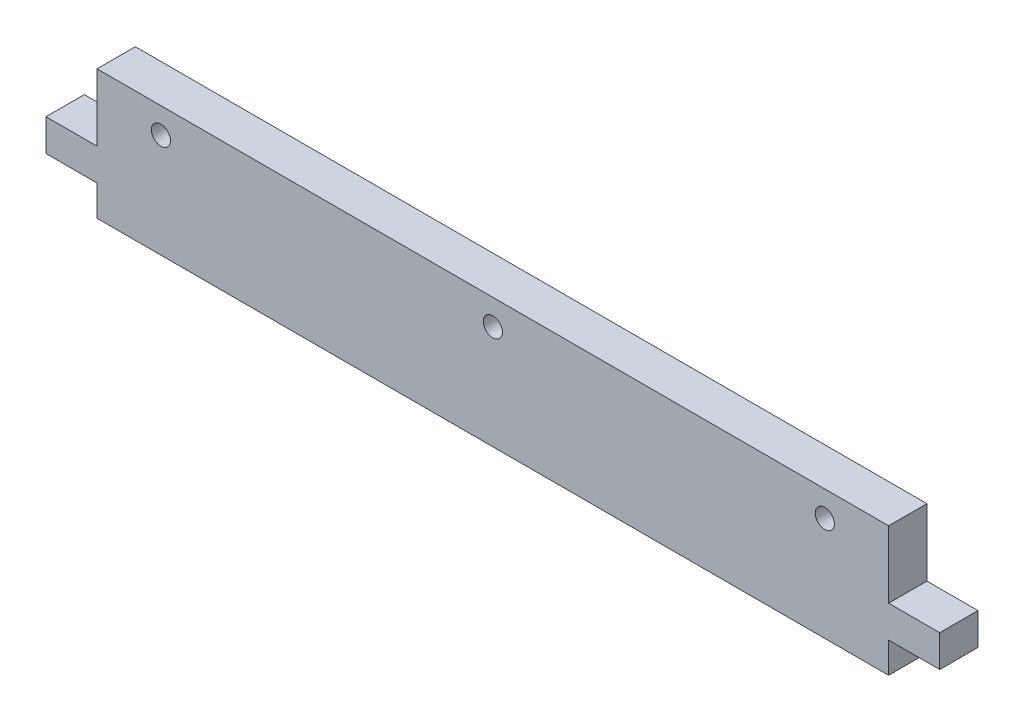
ISO-10303-21;
HEADER;
FILE_DESCRIPTION(('STEP AP214'),'2;1');
FILE_NAME('part.step','',(''),(''),'','','');
FILE_SCHEMA(('AUTOMOTIVE_DESIGN { 1 0 10303 214 1 1 1 1 }'));
ENDSEC;
DATA;
#1=APPLICATION_CONTEXT('core data for automotive mechanical design processes');
#2=APPLICATION_PROTOCOL_DEFINITION('international standard','automotive_design',2000,#1);
#3=PRODUCT_CONTEXT('',#1,'mechanical');
#4=PRODUCT('Part','Part','',(#3));
#5=PRODUCT_RELATED_PRODUCT_CATEGORY('part','',(#4));
#6=PRODUCT_DEFINITION_FORMATION('','',#4);
#7=PRODUCT_DEFINITION_CONTEXT('part definition',#1,'design');
#8=PRODUCT_DEFINITION('design','',#6,#7);
#9=PRODUCT_DEFINITION_SHAPE('','',#8);
#10=(LENGTH_UNIT() NAMED_UNIT(*) SI_UNIT(.MILLI.,.METRE.));
#11=(NAMED_UNIT(*) PLANE_ANGLE_UNIT() SI_UNIT($,.RADIAN.));
#12=(NAMED_UNIT(*) SI_UNIT($,.STERADIAN.) SOLID_ANGLE_UNIT());
#13=UNCERTAINTY_MEASURE_WITH_UNIT(LENGTH_MEASURE(1.E-05),#10,'distance_accuracy_value','');
#14=(GEOMETRIC_REPRESENTATION_CONTEXT(3) GLOBAL_UNCERTAINTY_ASSIGNED_CONTEXT((#13)) GLOBAL_UNIT_ASSIGNED_CONTEXT((#10,
#11,#12)) REPRESENTATION_CONTEXT('',''));
#15=CARTESIAN_POINT('',(0.,0.,0.));
#16=DIRECTION('',(0.,0.,1.));
#17=DIRECTION('',(1.,0.,0.));
#18=AXIS2_PLACEMENT_3D('',#15,#16,#17);
#19=CARTESIAN_POINT('',(124.,0.,6.));
#20=DIRECTION('',(-1.,0.,0.));
#21=DIRECTION('',(0.,0.,1.));
#22=AXIS2_PLACEMENT_3D('',#19,#20,#21);
#23=PLANE('',#22);
#24=DIRECTION('',(0.,0.,1.));
#25=VECTOR('',#24,1.);
#26=CARTESIAN_POINT('',(124.,9.78000000000002,0.));
#27=LINE('',#26,#25);
#28=CARTESIAN_POINT('',(124.,9.78000000000002,0.));
#29=VERTEX_POINT('',#28);
#30=CARTESIAN_POINT('',(124.,9.78000000000002,6.));
#31=VERTEX_POINT('',#30);
#32=EDGE_CURVE('E128',#29,#31,#27,.T.);
#33=ORIENTED_EDGE('',*,*,#32,.F.);
#34=DIRECTION('',(0.,1.,0.));
#35=VECTOR('',#34,1.);
#36=CARTESIAN_POINT('',(124.,0.,0.));
#37=LINE('',#36,#35);
#38=CARTESIAN_POINT('',(124.,20.28,0.));
#39=VERTEX_POINT('',#38);
#40=EDGE_CURVE('E141',#29,#39,#37,.T.);
#41=ORIENTED_EDGE('',*,*,#40,.T.);
#42=DIRECTION('',(0.,0.,-1.));
#43=VECTOR('',#42,1.);
#44=CARTESIAN_POINT('',(124.,20.28,6.));
#45=LINE('',#44,#43);
#46=CARTESIAN_POINT('',(124.,20.28,6.));
#47=VERTEX_POINT('',#46);
#48=EDGE_CURVE('E173',#47,#39,#45,.T.);
#49=ORIENTED_EDGE('',*,*,#48,.F.);
#50=DIRECTION('',(0.,1.,0.));
#51=VECTOR('',#50,1.);
#52=CARTESIAN_POINT('',(124.,0.,6.));
#53=LINE('',#52,#51);
#54=EDGE_CURVE('E143',#31,#47,#53,.T.);
#55=ORIENTED_EDGE('',*,*,#54,.F.);
#56=EDGE_LOOP('',(#33,#41,#49,#55));
#57=FACE_BOUND('',#56,.T.);
#58=ADVANCED_FACE('F34',(#57),#23,.F.);
#59=CARTESIAN_POINT('',(0.,0.,6.));
#60=DIRECTION('',(1.,0.,0.));
#61=DIRECTION('',(0.,0.,-1.));
#62=AXIS2_PLACEMENT_3D('',#59,#60,#61);
#63=PLANE('',#62);
#64=DIRECTION('',(0.,0.,1.));
#65=VECTOR('',#64,1.);
#66=CARTESIAN_POINT('',(0.,4.78,0.));
#67=LINE('',#66,#65);
#68=CARTESIAN_POINT('',(0.,4.78,0.));
#69=VERTEX_POINT('',#68);
#70=CARTESIAN_POINT('',(0.,4.78,6.));
#71=VERTEX_POINT('',#70);
#72=EDGE_CURVE('E275',#69,#71,#67,.T.);
#73=ORIENTED_EDGE('',*,*,#72,.F.);
#74=DIRECTION('',(0.,-1.,0.));
#75=VECTOR('',#74,1.);
#76=CARTESIAN_POINT('',(0.,0.,0.));
#77=LINE('',#76,#75);
#78=CARTESIAN_POINT('',(0.,0.,0.));
#79=VERTEX_POINT('',#78);
#80=EDGE_CURVE('E180',#69,#79,#77,.T.);
#81=ORIENTED_EDGE('',*,*,#80,.T.);
#82=DIRECTION('',(0.,0.,-1.));
#83=VECTOR('',#82,1.);
#84=CARTESIAN_POINT('',(0.,0.,6.));
#85=LINE('',#84,#83);
#86=CARTESIAN_POINT('',(0.,0.,6.));
#87=VERTEX_POINT('',#86);
#88=EDGE_CURVE('E11',#87,#79,#85,.T.);
#89=ORIENTED_EDGE('',*,*,#88,.F.);
#90=DIRECTION('',(0.,-1.,0.));
#91=VECTOR('',#90,1.);
#92=CARTESIAN_POINT('',(0.,0.,6.));
#93=LINE('',#92,#91);
#94=EDGE_CURVE('E169',#71,#87,#93,.T.);
#95=ORIENTED_EDGE('',*,*,#94,.F.);
#96=EDGE_LOOP('',(#73,#81,#89,#95));
#97=FACE_BOUND('',#96,.T.);
#98=ADVANCED_FACE('F248',(#97),#63,.F.);
#99=CARTESIAN_POINT('',(0.,20.28,0.));
#100=VERTEX_POINT('',#99);
#101=CARTESIAN_POINT('',(0.,9.78,0.));
#102=VERTEX_POINT('',#101);
#103=EDGE_CURVE('E156',#100,#102,#77,.T.);
#104=ORIENTED_EDGE('',*,*,#103,.T.);
#105=DIRECTION('',(0.,0.,1.));
#106=VECTOR('',#105,1.);
#107=CARTESIAN_POINT('',(0.,9.78,0.));
#108=LINE('',#107,#106);
#109=CARTESIAN_POINT('',(0.,9.78,6.));
#110=VERTEX_POINT('',#109);
#111=EDGE_CURVE('E293',#102,#110,#108,.T.);
#112=ORIENTED_EDGE('',*,*,#111,.T.);
#113=CARTESIAN_POINT('',(0.,20.28,6.));
#114=VERTEX_POINT('',#113);
#115=EDGE_CURVE('E316',#114,#110,#93,.T.);
#116=ORIENTED_EDGE('',*,*,#115,.F.);
#117=DIRECTION('',(0.,0.,-1.));
#118=VECTOR('',#117,1.);
#119=CARTESIAN_POINT('',(0.,20.28,6.));
#120=LINE('',#119,#118);
#121=EDGE_CURVE('E170',#114,#100,#120,.T.);
#122=ORIENTED_EDGE('',*,*,#121,.T.);
#123=EDGE_LOOP('',(#104,#112,#116,#122));
#124=FACE_BOUND('',#123,.T.);
#125=ADVANCED_FACE('F36',(#124),#63,.F.);
#126=CARTESIAN_POINT('',(0.,0.,6.));
#127=DIRECTION('',(0.,1.,0.));
#128=DIRECTION('',(0.,0.,1.));
#129=AXIS2_PLACEMENT_3D('',#126,#127,#128);
#130=PLANE('',#129);
#131=DIRECTION('',(1.,0.,0.));
#132=VECTOR('',#131,1.);
#133=CARTESIAN_POINT('',(0.,0.,0.));
#134=LINE('',#133,#132);
#135=CARTESIAN_POINT('',(124.,0.,0.));
#136=VERTEX_POINT('',#135);
#137=EDGE_CURVE('E152',#79,#136,#134,.T.);
#138=ORIENTED_EDGE('',*,*,#137,.T.);
#139=DIRECTION('',(0.,0.,-1.));
#140=VECTOR('',#139,1.);
#141=CARTESIAN_POINT('',(124.,0.,6.));
#142=LINE('',#141,#140);
#143=CARTESIAN_POINT('',(124.,0.,6.));
#144=VERTEX_POINT('',#143);
#145=EDGE_CURVE('E43',#144,#136,#142,.T.);
#146=ORIENTED_EDGE('',*,*,#145,.F.);
#147=DIRECTION('',(1.,0.,0.));
#148=VECTOR('',#147,1.);
#149=CARTESIAN_POINT('',(0.,0.,6.));
#150=LINE('',#149,#148);
#151=EDGE_CURVE('E187',#87,#144,#150,.T.);
#152=ORIENTED_EDGE('',*,*,#151,.F.);
#153=ORIENTED_EDGE('',*,*,#88,.T.);
#154=EDGE_LOOP('',(#138,#146,#152,#153));
#155=FACE_BOUND('',#154,.T.);
#156=ADVANCED_FACE('F258',(#155),#130,.F.);
#157=CARTESIAN_POINT('',(124.,4.78000000000002,0.));
#158=VERTEX_POINT('',#157);
#159=EDGE_CURVE('E151',#136,#158,#37,.T.);
#160=ORIENTED_EDGE('',*,*,#159,.T.);
#161=DIRECTION('',(0.,0.,1.));
#162=VECTOR('',#161,1.);
#163=CARTESIAN_POINT('',(124.,4.78000000000002,0.));
#164=LINE('',#163,#162);
#165=CARTESIAN_POINT('',(124.,4.78000000000002,6.));
#166=VERTEX_POINT('',#165);
#167=EDGE_CURVE('E144',#158,#166,#164,.T.);
#168=ORIENTED_EDGE('',*,*,#167,.T.);
#169=EDGE_CURVE('E161',#144,#166,#53,.T.);
#170=ORIENTED_EDGE('',*,*,#169,.F.);
#171=ORIENTED_EDGE('',*,*,#145,.T.);
#172=EDGE_LOOP('',(#160,#168,#170,#171));
#173=FACE_BOUND('',#172,.T.);
#174=ADVANCED_FACE('F250',(#173),#23,.F.);
#175=CARTESIAN_POINT('',(0.,20.28,6.));
#176=DIRECTION('',(0.,-1.,0.));
#177=DIRECTION('',(0.,0.,-1.));
#178=AXIS2_PLACEMENT_3D('',#175,#176,#177);
#179=PLANE('',#178);
#180=DIRECTION('',(-1.,0.,0.));
#181=VECTOR('',#180,1.);
#182=CARTESIAN_POINT('',(0.,20.28,0.));
#183=LINE('',#182,#181);
#184=EDGE_CURVE('E150',#39,#100,#183,.T.);
#185=ORIENTED_EDGE('',*,*,#184,.T.);
#186=ORIENTED_EDGE('',*,*,#121,.F.);
#187=DIRECTION('',(-1.,0.,0.));
#188=VECTOR('',#187,1.);
#189=CARTESIAN_POINT('',(0.,20.28,6.));
#190=LINE('',#189,#188);
#191=EDGE_CURVE('E174',#47,#114,#190,.T.);
#192=ORIENTED_EDGE('',*,*,#191,.F.);
#193=ORIENTED_EDGE('',*,*,#48,.T.);
#194=EDGE_LOOP('',(#185,#186,#192,#193));
#195=FACE_BOUND('',#194,.T.);
#196=ADVANCED_FACE('F257',(#195),#179,.F.);
#197=CARTESIAN_POINT('',(0.,0.,6.));
#198=DIRECTION('',(0.,0.,-1.));
#199=DIRECTION('',(-1.,0.,0.));
#200=AXIS2_PLACEMENT_3D('',#197,#198,#199);
#201=PLANE('',#200);
#202=CARTESIAN_POINT('',(10.,16.28,6.));
#203=DIRECTION('',(0.,0.,-1.));
#204=DIRECTION('',(-1.,0.,0.));
#205=AXIS2_PLACEMENT_3D('',#202,#203,#204);
#206=CIRCLE('',#205,1.5);
#207=CARTESIAN_POINT('',(8.50000000000001,16.28,6.));
#208=VERTEX_POINT('',#207);
#209=EDGE_CURVE('E362',#208,#208,#206,.T.);
#210=ORIENTED_EDGE('',*,*,#209,.T.);
#211=EDGE_LOOP('',(#210));
#212=FACE_BOUND('',#211,.T.);
#213=CARTESIAN_POINT('',(114.,16.28,6.));
#214=DIRECTION('',(0.,0.,-1.));
#215=DIRECTION('',(-1.,0.,0.));
#216=AXIS2_PLACEMENT_3D('',#213,#214,#215);
#217=CIRCLE('',#216,1.5);
#218=CARTESIAN_POINT('',(112.5,16.28,6.));
#219=VERTEX_POINT('',#218);
#220=EDGE_CURVE('E219',#219,#219,#217,.T.);
#221=ORIENTED_EDGE('',*,*,#220,.T.);
#222=EDGE_LOOP('',(#221));
#223=FACE_BOUND('',#222,.T.);
#224=CARTESIAN_POINT('',(62.,16.28,6.));
#225=DIRECTION('',(0.,0.,-1.));
#226=DIRECTION('',(-1.,0.,0.));
#227=AXIS2_PLACEMENT_3D('',#224,#225,#226);
#228=CIRCLE('',#227,1.5);
#229=CARTESIAN_POINT('',(60.5,16.28,6.));
#230=VERTEX_POINT('',#229);
#231=EDGE_CURVE('E210',#230,#230,#228,.T.);
#232=ORIENTED_EDGE('',*,*,#231,.T.);
#233=EDGE_LOOP('',(#232));
#234=FACE_BOUND('',#233,.T.);
#235=ORIENTED_EDGE('',*,*,#115,.T.);
#236=DIRECTION('',(-1.,0.,0.));
#237=VECTOR('',#236,1.);
#238=CARTESIAN_POINT('',(0.,9.78,6.));
#239=LINE('',#238,#237);
#240=CARTESIAN_POINT('',(-8.,9.78,6.));
#241=VERTEX_POINT('',#240);
#242=EDGE_CURVE('E59',#110,#241,#239,.T.);
#243=ORIENTED_EDGE('',*,*,#242,.T.);
#244=DIRECTION('',(0.,-1.,0.));
#245=VECTOR('',#244,1.);
#246=CARTESIAN_POINT('',(-8.,9.78,6.));
#247=LINE('',#246,#245);
#248=CARTESIAN_POINT('',(-8.,4.78,6.));
#249=VERTEX_POINT('',#248);
#250=EDGE_CURVE('E226',#241,#249,#247,.T.);
#251=ORIENTED_EDGE('',*,*,#250,.T.);
#252=DIRECTION('',(1.,0.,0.));
#253=VECTOR('',#252,1.);
#254=CARTESIAN_POINT('',(0.,4.78,6.));
#255=LINE('',#254,#253);
#256=EDGE_CURVE('E301',#249,#71,#255,.T.);
#257=ORIENTED_EDGE('',*,*,#256,.T.);
#258=ORIENTED_EDGE('',*,*,#94,.T.);
#259=ORIENTED_EDGE('',*,*,#151,.T.);
#260=ORIENTED_EDGE('',*,*,#169,.T.);
#261=DIRECTION('',(1.,0.,0.));
#262=VECTOR('',#261,1.);
#263=CARTESIAN_POINT('',(124.,4.78000000000002,6.));
#264=LINE('',#263,#262);
#265=CARTESIAN_POINT('',(132.,4.78000000000002,6.));
#266=VERTEX_POINT('',#265);
#267=EDGE_CURVE('E51',#166,#266,#264,.T.);
#268=ORIENTED_EDGE('',*,*,#267,.T.);
#269=DIRECTION('',(0.,1.,0.));
#270=VECTOR('',#269,1.);
#271=CARTESIAN_POINT('',(132.,9.78000000000002,6.));
#272=LINE('',#271,#270);
#273=CARTESIAN_POINT('',(132.,9.78000000000002,6.));
#274=VERTEX_POINT('',#273);
#275=EDGE_CURVE('E136',#266,#274,#272,.T.);
#276=ORIENTED_EDGE('',*,*,#275,.T.);
#277=DIRECTION('',(-1.,0.,0.));
#278=VECTOR('',#277,1.);
#279=CARTESIAN_POINT('',(124.,9.78000000000002,6.));
#280=LINE('',#279,#278);
#281=EDGE_CURVE('E192',#274,#31,#280,.T.);
#282=ORIENTED_EDGE('',*,*,#281,.T.);
#283=ORIENTED_EDGE('',*,*,#54,.T.);
#284=ORIENTED_EDGE('',*,*,#191,.T.);
#285=EDGE_LOOP('',(#235,#243,#251,#257,#258,#259,#260,#268,#276,#282,#283,#284));
#286=FACE_BOUND('',#285,.T.);
#287=ADVANCED_FACE('F233',(#212,#223,#234,#286),#201,.F.);
#288=CARTESIAN_POINT('',(0.,0.,0.));
#289=DIRECTION('',(0.,0.,-1.));
#290=DIRECTION('',(-1.,0.,0.));
#291=AXIS2_PLACEMENT_3D('',#288,#289,#290);
#292=PLANE('',#291);
#293=CARTESIAN_POINT('',(10.,16.28,0.));
#294=DIRECTION('',(0.,0.,-1.));
#295=DIRECTION('',(1.,0.,0.));
#296=AXIS2_PLACEMENT_3D('',#293,#294,#295);
#297=CIRCLE('',#296,1.5);
#298=CARTESIAN_POINT('',(11.5,16.28,0.));
#299=VERTEX_POINT('',#298);
#300=EDGE_CURVE('E338',#299,#299,#297,.T.);
#301=ORIENTED_EDGE('',*,*,#300,.F.);
#302=EDGE_LOOP('',(#301));
#303=FACE_BOUND('',#302,.T.);
#304=CARTESIAN_POINT('',(114.,16.28,0.));
#305=DIRECTION('',(0.,0.,-1.));
#306=DIRECTION('',(-1.,0.,0.));
#307=AXIS2_PLACEMENT_3D('',#304,#305,#306);
#308=CIRCLE('',#307,1.5);
#309=CARTESIAN_POINT('',(112.5,16.28,0.));
#310=VERTEX_POINT('',#309);
#311=EDGE_CURVE('E342',#310,#310,#308,.T.);
#312=ORIENTED_EDGE('',*,*,#311,.F.);
#313=EDGE_LOOP('',(#312));
#314=FACE_BOUND('',#313,.T.);
#315=CARTESIAN_POINT('',(62.,16.28,0.));
#316=DIRECTION('',(0.,0.,-1.));
#317=DIRECTION('',(-1.,0.,0.));
#318=AXIS2_PLACEMENT_3D('',#315,#316,#317);
#319=CIRCLE('',#318,1.5);
#320=CARTESIAN_POINT('',(60.5,16.28,0.));
#321=VERTEX_POINT('',#320);
#322=EDGE_CURVE('E214',#321,#321,#319,.T.);
#323=ORIENTED_EDGE('',*,*,#322,.F.);
#324=EDGE_LOOP('',(#323));
#325=FACE_BOUND('',#324,.T.);
#326=ORIENTED_EDGE('',*,*,#103,.F.);
#327=ORIENTED_EDGE('',*,*,#184,.F.);
#328=ORIENTED_EDGE('',*,*,#40,.F.);
#329=DIRECTION('',(-1.,0.,0.));
#330=VECTOR('',#329,1.);
#331=CARTESIAN_POINT('',(124.,9.78000000000002,0.));
#332=LINE('',#331,#330);
#333=CARTESIAN_POINT('',(132.,9.78000000000002,0.));
#334=VERTEX_POINT('',#333);
#335=EDGE_CURVE('E124',#334,#29,#332,.T.);
#336=ORIENTED_EDGE('',*,*,#335,.F.);
#337=DIRECTION('',(0.,1.,0.));
#338=VECTOR('',#337,1.);
#339=CARTESIAN_POINT('',(132.,9.78000000000002,0.));
#340=LINE('',#339,#338);
#341=CARTESIAN_POINT('',(132.,4.78000000000002,0.));
#342=VERTEX_POINT('',#341);
#343=EDGE_CURVE('E145',#342,#334,#340,.T.);
#344=ORIENTED_EDGE('',*,*,#343,.F.);
#345=DIRECTION('',(1.,0.,0.));
#346=VECTOR('',#345,1.);
#347=CARTESIAN_POINT('',(124.,4.78000000000002,0.));
#348=LINE('',#347,#346);
#349=EDGE_CURVE('E135',#158,#342,#348,.T.);
#350=ORIENTED_EDGE('',*,*,#349,.F.);
#351=ORIENTED_EDGE('',*,*,#159,.F.);
#352=ORIENTED_EDGE('',*,*,#137,.F.);
#353=ORIENTED_EDGE('',*,*,#80,.F.);
#354=DIRECTION('',(1.,0.,0.));
#355=VECTOR('',#354,1.);
#356=CARTESIAN_POINT('',(0.,4.78,0.));
#357=LINE('',#356,#355);
#358=CARTESIAN_POINT('',(-8.,4.78,0.));
#359=VERTEX_POINT('',#358);
#360=EDGE_CURVE('E288',#359,#69,#357,.T.);
#361=ORIENTED_EDGE('',*,*,#360,.F.);
#362=DIRECTION('',(0.,-1.,0.));
#363=VECTOR('',#362,1.);
#364=CARTESIAN_POINT('',(-8.,9.78,0.));
#365=LINE('',#364,#363);
#366=CARTESIAN_POINT('',(-8.,9.78,0.));
#367=VERTEX_POINT('',#366);
#368=EDGE_CURVE('E205',#367,#359,#365,.T.);
#369=ORIENTED_EDGE('',*,*,#368,.F.);
#370=DIRECTION('',(-1.,0.,0.));
#371=VECTOR('',#370,1.);
#372=CARTESIAN_POINT('',(0.,9.78,0.));
#373=LINE('',#372,#371);
#374=EDGE_CURVE('E299',#102,#367,#373,.T.);
#375=ORIENTED_EDGE('',*,*,#374,.F.);
#376=EDGE_LOOP('',(#326,#327,#328,#336,#344,#350,#351,#352,#353,#361,#369,#375));
#377=FACE_BOUND('',#376,.T.);
#378=ADVANCED_FACE('F149',(#303,#314,#325,#377),#292,.T.);
#379=CARTESIAN_POINT('',(0.,4.78,0.));
#380=DIRECTION('',(0.,-1.,0.));
#381=DIRECTION('',(1.,0.,0.));
#382=AXIS2_PLACEMENT_3D('',#379,#380,#381);
#383=PLANE('',#382);
#384=ORIENTED_EDGE('',*,*,#256,.F.);
#385=DIRECTION('',(0.,0.,1.));
#386=VECTOR('',#385,1.);
#387=CARTESIAN_POINT('',(-8.,4.78,0.));
#388=LINE('',#387,#386);
#389=EDGE_CURVE('E276',#359,#249,#388,.T.);
#390=ORIENTED_EDGE('',*,*,#389,.F.);
#391=ORIENTED_EDGE('',*,*,#360,.T.);
#392=ORIENTED_EDGE('',*,*,#72,.T.);
#393=EDGE_LOOP('',(#384,#390,#391,#392));
#394=FACE_BOUND('',#393,.T.);
#395=ADVANCED_FACE('F310',(#394),#383,.T.);
#396=CARTESIAN_POINT('',(-8.,9.78,0.));
#397=DIRECTION('',(-1.,0.,0.));
#398=DIRECTION('',(0.,0.,1.));
#399=AXIS2_PLACEMENT_3D('',#396,#397,#398);
#400=PLANE('',#399);
#401=ORIENTED_EDGE('',*,*,#250,.F.);
#402=DIRECTION('',(0.,0.,1.));
#403=VECTOR('',#402,1.);
#404=CARTESIAN_POINT('',(-8.,9.78,0.));
#405=LINE('',#404,#403);
#406=EDGE_CURVE('E281',#367,#241,#405,.T.);
#407=ORIENTED_EDGE('',*,*,#406,.F.);
#408=ORIENTED_EDGE('',*,*,#368,.T.);
#409=ORIENTED_EDGE('',*,*,#389,.T.);
#410=EDGE_LOOP('',(#401,#407,#408,#409));
#411=FACE_BOUND('',#410,.T.);
#412=ADVANCED_FACE('F312',(#411),#400,.T.);
#413=CARTESIAN_POINT('',(0.,9.78,0.));
#414=DIRECTION('',(0.,1.,0.));
#415=DIRECTION('',(-1.,0.,0.));
#416=AXIS2_PLACEMENT_3D('',#413,#414,#415);
#417=PLANE('',#416);
#418=ORIENTED_EDGE('',*,*,#242,.F.);
#419=ORIENTED_EDGE('',*,*,#111,.F.);
#420=ORIENTED_EDGE('',*,*,#374,.T.);
#421=ORIENTED_EDGE('',*,*,#406,.T.);
#422=EDGE_LOOP('',(#418,#419,#420,#421));
#423=FACE_BOUND('',#422,.T.);
#424=ADVANCED_FACE('F244',(#423),#417,.T.);
#425=CARTESIAN_POINT('',(124.,9.78000000000002,0.));
#426=DIRECTION('',(0.,1.,0.));
#427=DIRECTION('',(0.,0.,1.));
#428=AXIS2_PLACEMENT_3D('',#425,#426,#427);
#429=PLANE('',#428);
#430=ORIENTED_EDGE('',*,*,#281,.F.);
#431=DIRECTION('',(0.,0.,1.));
#432=VECTOR('',#431,1.);
#433=CARTESIAN_POINT('',(132.,9.78000000000002,0.));
#434=LINE('',#433,#432);
#435=EDGE_CURVE('E130',#334,#274,#434,.T.);
#436=ORIENTED_EDGE('',*,*,#435,.F.);
#437=ORIENTED_EDGE('',*,*,#335,.T.);
#438=ORIENTED_EDGE('',*,*,#32,.T.);
#439=EDGE_LOOP('',(#430,#436,#437,#438));
#440=FACE_BOUND('',#439,.T.);
#441=ADVANCED_FACE('F127',(#440),#429,.T.);
#442=CARTESIAN_POINT('',(132.,9.78000000000002,0.));
#443=DIRECTION('',(1.,0.,0.));
#444=DIRECTION('',(0.,0.,-1.));
#445=AXIS2_PLACEMENT_3D('',#442,#443,#444);
#446=PLANE('',#445);
#447=ORIENTED_EDGE('',*,*,#275,.F.);
#448=DIRECTION('',(0.,0.,1.));
#449=VECTOR('',#448,1.);
#450=CARTESIAN_POINT('',(132.,4.78000000000002,0.));
#451=LINE('',#450,#449);
#452=EDGE_CURVE('E197',#342,#266,#451,.T.);
#453=ORIENTED_EDGE('',*,*,#452,.F.);
#454=ORIENTED_EDGE('',*,*,#343,.T.);
#455=ORIENTED_EDGE('',*,*,#435,.T.);
#456=EDGE_LOOP('',(#447,#453,#454,#455));
#457=FACE_BOUND('',#456,.T.);
#458=ADVANCED_FACE('F235',(#457),#446,.T.);
#459=CARTESIAN_POINT('',(124.,4.78000000000002,0.));
#460=DIRECTION('',(0.,-1.,0.));
#461=DIRECTION('',(1.,0.,0.));
#462=AXIS2_PLACEMENT_3D('',#459,#460,#461);
#463=PLANE('',#462);
#464=ORIENTED_EDGE('',*,*,#267,.F.);
#465=ORIENTED_EDGE('',*,*,#167,.F.);
#466=ORIENTED_EDGE('',*,*,#349,.T.);
#467=ORIENTED_EDGE('',*,*,#452,.T.);
#468=EDGE_LOOP('',(#464,#465,#466,#467));
#469=FACE_BOUND('',#468,.T.);
#470=ADVANCED_FACE('F229',(#469),#463,.T.);
#471=CARTESIAN_POINT('',(62.,16.28,6.00005));
#472=DIRECTION('',(0.,0.,-1.));
#473=DIRECTION('',(-1.,0.,0.));
#474=AXIS2_PLACEMENT_3D('',#471,#472,#473);
#475=CYLINDRICAL_SURFACE('',#474,1.5);
#476=ORIENTED_EDGE('',*,*,#322,.T.);
#477=EDGE_LOOP('',(#476));
#478=FACE_BOUND('',#477,.T.);
#479=ORIENTED_EDGE('',*,*,#231,.F.);
#480=EDGE_LOOP('',(#479));
#481=FACE_BOUND('',#480,.T.);
#482=ADVANCED_FACE('F242',(#478,#481),#475,.F.);
#483=CARTESIAN_POINT('',(114.,16.28,6.00005));
#484=DIRECTION('',(0.,0.,-1.));
#485=DIRECTION('',(-1.,0.,0.));
#486=AXIS2_PLACEMENT_3D('',#483,#484,#485);
#487=CYLINDRICAL_SURFACE('',#486,1.5);
#488=ORIENTED_EDGE('',*,*,#311,.T.);
#489=EDGE_LOOP('',(#488));
#490=FACE_BOUND('',#489,.T.);
#491=ORIENTED_EDGE('',*,*,#220,.F.);
#492=EDGE_LOOP('',(#491));
#493=FACE_BOUND('',#492,.T.);
#494=ADVANCED_FACE('F347',(#490,#493),#487,.F.);
#495=CARTESIAN_POINT('',(10.,16.28,6.00005));
#496=DIRECTION('',(0.,0.,-1.));
#497=DIRECTION('',(-1.,0.,0.));
#498=AXIS2_PLACEMENT_3D('',#495,#496,#497);
#499=CYLINDRICAL_SURFACE('',#498,1.5);
#500=ORIENTED_EDGE('',*,*,#300,.T.);
#501=EDGE_LOOP('',(#500));
#502=FACE_BOUND('',#501,.T.);
#503=ORIENTED_EDGE('',*,*,#209,.F.);
#504=EDGE_LOOP('',(#503));
#505=FACE_BOUND('',#504,.T.);
#506=ADVANCED_FACE('F351',(#502,#505),#499,.F.);
#507=CLOSED_SHELL('',(#58,#98,#125,#156,#174,#196,#287,#378,#395,#412,#424,#441,#458,#470,#482,
#494,#506));
#508=MANIFOLD_SOLID_BREP('B2',#507);
#509=ADVANCED_BREP_SHAPE_REPRESENTATION('',(#18,#508),#14);
#510=SHAPE_DEFINITION_REPRESENTATION(#9,#509);
ENDSEC;
END-ISO-10303-21;
